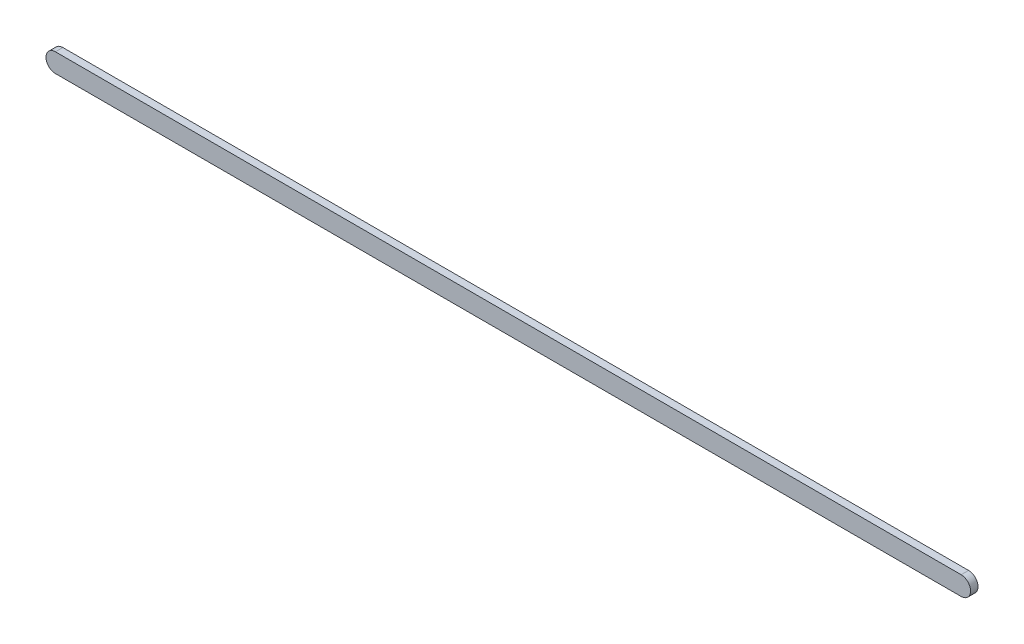
ISO-10303-21;
HEADER;
FILE_DESCRIPTION(('STEP AP214'),'2;1');
FILE_NAME('part.step','',(''),(''),'','','');
FILE_SCHEMA(('AUTOMOTIVE_DESIGN { 1 0 10303 214 1 1 1 1 }'));
ENDSEC;
DATA;
#1=APPLICATION_CONTEXT('core data for automotive mechanical design processes');
#2=APPLICATION_PROTOCOL_DEFINITION('international standard','automotive_design',2000,#1);
#3=PRODUCT_CONTEXT('',#1,'mechanical');
#4=PRODUCT('Part','Part','',(#3));
#5=PRODUCT_RELATED_PRODUCT_CATEGORY('part','',(#4));
#6=PRODUCT_DEFINITION_FORMATION('','',#4);
#7=PRODUCT_DEFINITION_CONTEXT('part definition',#1,'design');
#8=PRODUCT_DEFINITION('design','',#6,#7);
#9=PRODUCT_DEFINITION_SHAPE('','',#8);
#10=(LENGTH_UNIT() NAMED_UNIT(*) SI_UNIT(.MILLI.,.METRE.));
#11=(NAMED_UNIT(*) PLANE_ANGLE_UNIT() SI_UNIT($,.RADIAN.));
#12=(NAMED_UNIT(*) SI_UNIT($,.STERADIAN.) SOLID_ANGLE_UNIT());
#13=UNCERTAINTY_MEASURE_WITH_UNIT(LENGTH_MEASURE(1.E-05),#10,'distance_accuracy_value','');
#14=(GEOMETRIC_REPRESENTATION_CONTEXT(3) GLOBAL_UNCERTAINTY_ASSIGNED_CONTEXT((#13)) GLOBAL_UNIT_ASSIGNED_CONTEXT((#10,
#11,#12)) REPRESENTATION_CONTEXT('',''));
#15=CARTESIAN_POINT('',(0.,0.,0.));
#16=DIRECTION('',(0.,0.,1.));
#17=DIRECTION('',(1.,0.,0.));
#18=AXIS2_PLACEMENT_3D('',#15,#16,#17);
#19=CARTESIAN_POINT('',(89.154,52.197,0.));
#20=DIRECTION('',(0.,1.,0.));
#21=DIRECTION('',(1.,0.,0.));
#22=AXIS2_PLACEMENT_3D('',#19,#20,#21);
#23=PLANE('',#22);
#24=DIRECTION('',(1.,0.,0.));
#25=VECTOR('',#24,1.);
#26=CARTESIAN_POINT('',(89.154,52.197,0.1999996));
#27=LINE('',#26,#25);
#28=CARTESIAN_POINT('',(89.154,52.197,0.1999996));
#29=VERTEX_POINT('',#28);
#30=CARTESIAN_POINT('',(113.538,52.197,0.1999996));
#31=VERTEX_POINT('',#30);
#32=EDGE_CURVE('E11',#29,#31,#27,.T.);
#33=ORIENTED_EDGE('',*,*,#32,.F.);
#34=DIRECTION('',(0.,0.,1.));
#35=VECTOR('',#34,1.);
#36=CARTESIAN_POINT('',(89.154,52.197,0.));
#37=LINE('',#36,#35);
#38=CARTESIAN_POINT('',(89.154,52.197,0.));
#39=VERTEX_POINT('',#38);
#40=EDGE_CURVE('E24',#39,#29,#37,.T.);
#41=ORIENTED_EDGE('',*,*,#40,.F.);
#42=DIRECTION('',(1.,0.,0.));
#43=VECTOR('',#42,1.);
#44=CARTESIAN_POINT('',(89.154,52.197,0.));
#45=LINE('',#44,#43);
#46=CARTESIAN_POINT('',(113.538,52.197,0.));
#47=VERTEX_POINT('',#46);
#48=EDGE_CURVE('E75',#39,#47,#45,.T.);
#49=ORIENTED_EDGE('',*,*,#48,.T.);
#50=DIRECTION('',(0.,0.,1.));
#51=VECTOR('',#50,1.);
#52=CARTESIAN_POINT('',(113.538,52.197,0.));
#53=LINE('',#52,#51);
#54=EDGE_CURVE('E37',#47,#31,#53,.T.);
#55=ORIENTED_EDGE('',*,*,#54,.T.);
#56=EDGE_LOOP('',(#33,#41,#49,#55));
#57=FACE_BOUND('',#56,.T.);
#58=ADVANCED_FACE('F17',(#57),#23,.F.);
#59=CARTESIAN_POINT('',(113.538,52.451,0.));
#60=DIRECTION('',(0.,0.,-1.));
#61=DIRECTION('',(0.,-1.,0.));
#62=AXIS2_PLACEMENT_3D('',#59,#60,#61);
#63=CYLINDRICAL_SURFACE('',#62,0.254);
#64=CARTESIAN_POINT('',(113.538,52.451,0.1999996));
#65=DIRECTION('',(0.,0.,1.));
#66=DIRECTION('',(0.,-1.,0.));
#67=AXIS2_PLACEMENT_3D('',#64,#65,#66);
#68=CIRCLE('',#67,0.254);
#69=CARTESIAN_POINT('',(113.538,52.705,0.1999996));
#70=VERTEX_POINT('',#69);
#71=EDGE_CURVE('E83',#31,#70,#68,.T.);
#72=ORIENTED_EDGE('',*,*,#71,.F.);
#73=ORIENTED_EDGE('',*,*,#54,.F.);
#74=CARTESIAN_POINT('',(113.538,52.451,0.));
#75=DIRECTION('',(0.,0.,1.));
#76=DIRECTION('',(0.,-1.,0.));
#77=AXIS2_PLACEMENT_3D('',#74,#75,#76);
#78=CIRCLE('',#77,0.254);
#79=CARTESIAN_POINT('',(113.538,52.705,0.));
#80=VERTEX_POINT('',#79);
#81=EDGE_CURVE('E81',#47,#80,#78,.T.);
#82=ORIENTED_EDGE('',*,*,#81,.T.);
#83=DIRECTION('',(0.,0.,1.));
#84=VECTOR('',#83,1.);
#85=CARTESIAN_POINT('',(113.538,52.705,0.));
#86=LINE('',#85,#84);
#87=EDGE_CURVE('E67',#80,#70,#86,.T.);
#88=ORIENTED_EDGE('',*,*,#87,.T.);
#89=EDGE_LOOP('',(#72,#73,#82,#88));
#90=FACE_BOUND('',#89,.T.);
#91=ADVANCED_FACE('F89',(#90),#63,.T.);
#92=CARTESIAN_POINT('',(113.538,52.705,0.));
#93=DIRECTION('',(0.,-1.,0.));
#94=DIRECTION('',(-1.,0.,0.));
#95=AXIS2_PLACEMENT_3D('',#92,#93,#94);
#96=PLANE('',#95);
#97=DIRECTION('',(-1.,0.,0.));
#98=VECTOR('',#97,1.);
#99=CARTESIAN_POINT('',(113.538,52.705,0.1999996));
#100=LINE('',#99,#98);
#101=CARTESIAN_POINT('',(89.154,52.705,0.1999996));
#102=VERTEX_POINT('',#101);
#103=EDGE_CURVE('E71',#70,#102,#100,.T.);
#104=ORIENTED_EDGE('',*,*,#103,.F.);
#105=ORIENTED_EDGE('',*,*,#87,.F.);
#106=DIRECTION('',(-1.,0.,0.));
#107=VECTOR('',#106,1.);
#108=CARTESIAN_POINT('',(113.538,52.705,0.));
#109=LINE('',#108,#107);
#110=CARTESIAN_POINT('',(89.154,52.705,0.));
#111=VERTEX_POINT('',#110);
#112=EDGE_CURVE('E63',#80,#111,#109,.T.);
#113=ORIENTED_EDGE('',*,*,#112,.T.);
#114=DIRECTION('',(0.,0.,1.));
#115=VECTOR('',#114,1.);
#116=CARTESIAN_POINT('',(89.154,52.705,0.));
#117=LINE('',#116,#115);
#118=EDGE_CURVE('E53',#111,#102,#117,.T.);
#119=ORIENTED_EDGE('',*,*,#118,.T.);
#120=EDGE_LOOP('',(#104,#105,#113,#119));
#121=FACE_BOUND('',#120,.T.);
#122=ADVANCED_FACE('F66',(#121),#96,.F.);
#123=CARTESIAN_POINT('',(89.154,52.451,0.));
#124=DIRECTION('',(0.,0.,-1.));
#125=DIRECTION('',(0.,1.,0.));
#126=AXIS2_PLACEMENT_3D('',#123,#124,#125);
#127=CYLINDRICAL_SURFACE('',#126,0.254);
#128=CARTESIAN_POINT('',(89.154,52.451,0.1999996));
#129=DIRECTION('',(0.,0.,1.));
#130=DIRECTION('',(0.,1.,0.));
#131=AXIS2_PLACEMENT_3D('',#128,#129,#130);
#132=CIRCLE('',#131,0.254);
#133=EDGE_CURVE('E59',#102,#29,#132,.T.);
#134=ORIENTED_EDGE('',*,*,#133,.F.);
#135=ORIENTED_EDGE('',*,*,#118,.F.);
#136=CARTESIAN_POINT('',(89.154,52.451,0.));
#137=DIRECTION('',(0.,0.,1.));
#138=DIRECTION('',(0.,1.,0.));
#139=AXIS2_PLACEMENT_3D('',#136,#137,#138);
#140=CIRCLE('',#139,0.254);
#141=EDGE_CURVE('E57',#111,#39,#140,.T.);
#142=ORIENTED_EDGE('',*,*,#141,.T.);
#143=ORIENTED_EDGE('',*,*,#40,.T.);
#144=EDGE_LOOP('',(#134,#135,#142,#143));
#145=FACE_BOUND('',#144,.T.);
#146=ADVANCED_FACE('F55',(#145),#127,.T.);
#147=CARTESIAN_POINT('',(89.154,52.197,0.));
#148=DIRECTION('',(0.,0.,-1.));
#149=DIRECTION('',(-1.,0.,0.));
#150=AXIS2_PLACEMENT_3D('',#147,#148,#149);
#151=PLANE('',#150);
#152=ORIENTED_EDGE('',*,*,#141,.F.);
#153=ORIENTED_EDGE('',*,*,#112,.F.);
#154=ORIENTED_EDGE('',*,*,#81,.F.);
#155=ORIENTED_EDGE('',*,*,#48,.F.);
#156=EDGE_LOOP('',(#152,#153,#154,#155));
#157=FACE_BOUND('',#156,.T.);
#158=ADVANCED_FACE('F74',(#157),#151,.T.);
#159=CARTESIAN_POINT('',(89.154,52.197,0.1999996));
#160=DIRECTION('',(0.,0.,-1.));
#161=DIRECTION('',(-1.,0.,0.));
#162=AXIS2_PLACEMENT_3D('',#159,#160,#161);
#163=PLANE('',#162);
#164=ORIENTED_EDGE('',*,*,#32,.T.);
#165=ORIENTED_EDGE('',*,*,#71,.T.);
#166=ORIENTED_EDGE('',*,*,#103,.T.);
#167=ORIENTED_EDGE('',*,*,#133,.T.);
#168=EDGE_LOOP('',(#164,#165,#166,#167));
#169=FACE_BOUND('',#168,.T.);
#170=ADVANCED_FACE('F91',(#169),#163,.F.);
#171=CLOSED_SHELL('',(#58,#91,#122,#146,#158,#170));
#172=MANIFOLD_SOLID_BREP('B1',#171);
#173=ADVANCED_BREP_SHAPE_REPRESENTATION('',(#18,#172),#14);
#174=SHAPE_DEFINITION_REPRESENTATION(#9,#173);
ENDSEC;
END-ISO-10303-21;
